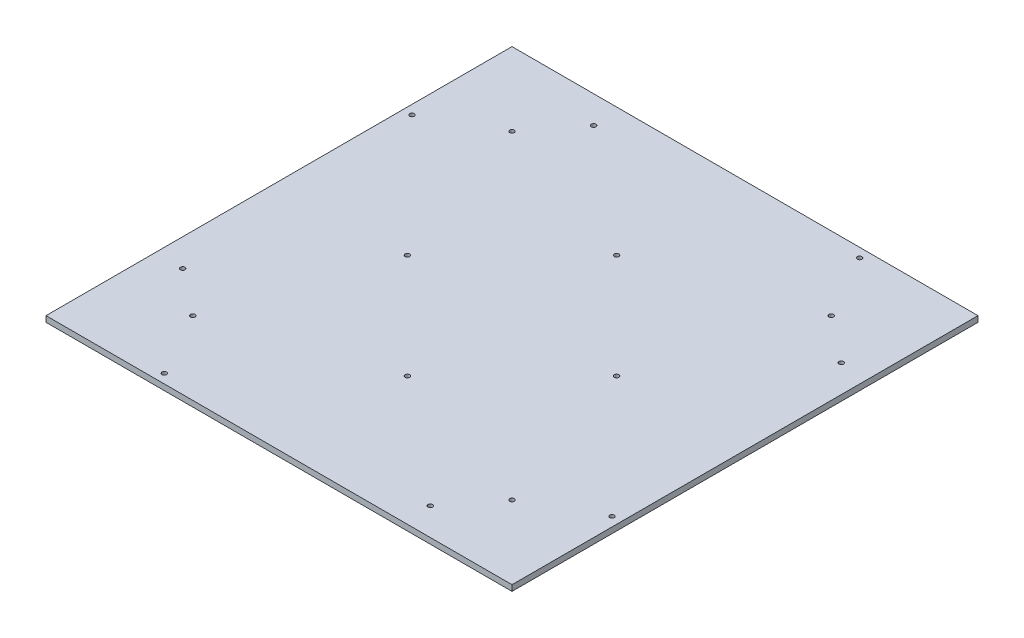
ISO-10303-21;
HEADER;
FILE_DESCRIPTION(('STEP AP214'),'2;1');
FILE_NAME('part.step','',(''),(''),'','','');
FILE_SCHEMA(('AUTOMOTIVE_DESIGN { 1 0 10303 214 1 1 1 1 }'));
ENDSEC;
DATA;
#1=APPLICATION_CONTEXT('core data for automotive mechanical design processes');
#2=APPLICATION_PROTOCOL_DEFINITION('international standard','automotive_design',2000,#1);
#3=PRODUCT_CONTEXT('',#1,'mechanical');
#4=PRODUCT('Part','Part','',(#3));
#5=PRODUCT_RELATED_PRODUCT_CATEGORY('part','',(#4));
#6=PRODUCT_DEFINITION_FORMATION('','',#4);
#7=PRODUCT_DEFINITION_CONTEXT('part definition',#1,'design');
#8=PRODUCT_DEFINITION('design','',#6,#7);
#9=PRODUCT_DEFINITION_SHAPE('','',#8);
#10=(LENGTH_UNIT() NAMED_UNIT(*) SI_UNIT(.MILLI.,.METRE.));
#11=(NAMED_UNIT(*) PLANE_ANGLE_UNIT() SI_UNIT($,.RADIAN.));
#12=(NAMED_UNIT(*) SI_UNIT($,.STERADIAN.) SOLID_ANGLE_UNIT());
#13=UNCERTAINTY_MEASURE_WITH_UNIT(LENGTH_MEASURE(1.E-05),#10,'distance_accuracy_value','');
#14=(GEOMETRIC_REPRESENTATION_CONTEXT(3) GLOBAL_UNCERTAINTY_ASSIGNED_CONTEXT((#13)) GLOBAL_UNIT_ASSIGNED_CONTEXT((#10,
#11,#12)) REPRESENTATION_CONTEXT('',''));
#15=CARTESIAN_POINT('',(0.,0.,0.));
#16=DIRECTION('',(0.,0.,1.));
#17=DIRECTION('',(1.,0.,0.));
#18=AXIS2_PLACEMENT_3D('',#15,#16,#17);
#19=CARTESIAN_POINT('',(127.,1.5875,127.));
#20=DIRECTION('',(-1.,0.,0.));
#21=DIRECTION('',(0.,0.,1.));
#22=AXIS2_PLACEMENT_3D('',#19,#20,#21);
#23=PLANE('',#22);
#24=DIRECTION('',(0.,0.,-1.));
#25=VECTOR('',#24,1.);
#26=CARTESIAN_POINT('',(127.,-1.5875,127.));
#27=LINE('',#26,#25);
#28=CARTESIAN_POINT('',(127.,-1.5875,127.));
#29=VERTEX_POINT('',#28);
#30=CARTESIAN_POINT('',(127.,-1.5875,-127.));
#31=VERTEX_POINT('',#30);
#32=EDGE_CURVE('E100',#29,#31,#27,.T.);
#33=ORIENTED_EDGE('',*,*,#32,.T.);
#34=DIRECTION('',(0.,-1.,0.));
#35=VECTOR('',#34,1.);
#36=CARTESIAN_POINT('',(127.,1.5875,-127.));
#37=LINE('',#36,#35);
#38=CARTESIAN_POINT('',(127.,1.5875,-127.));
#39=VERTEX_POINT('',#38);
#40=EDGE_CURVE('E11',#39,#31,#37,.T.);
#41=ORIENTED_EDGE('',*,*,#40,.F.);
#42=DIRECTION('',(0.,0.,-1.));
#43=VECTOR('',#42,1.);
#44=CARTESIAN_POINT('',(127.,1.5875,127.));
#45=LINE('',#44,#43);
#46=CARTESIAN_POINT('',(127.,1.5875,127.));
#47=VERTEX_POINT('',#46);
#48=EDGE_CURVE('E88',#47,#39,#45,.T.);
#49=ORIENTED_EDGE('',*,*,#48,.F.);
#50=DIRECTION('',(0.,-1.,0.));
#51=VECTOR('',#50,1.);
#52=CARTESIAN_POINT('',(127.,1.5875,127.));
#53=LINE('',#52,#51);
#54=EDGE_CURVE('E96',#47,#29,#53,.T.);
#55=ORIENTED_EDGE('',*,*,#54,.T.);
#56=EDGE_LOOP('',(#33,#41,#49,#55));
#57=FACE_BOUND('',#56,.T.);
#58=ADVANCED_FACE('F37',(#57),#23,.F.);
#59=CARTESIAN_POINT('',(-127.,1.5875,-127.));
#60=DIRECTION('',(0.,0.,1.));
#61=DIRECTION('',(1.,0.,0.));
#62=AXIS2_PLACEMENT_3D('',#59,#60,#61);
#63=PLANE('',#62);
#64=DIRECTION('',(-1.,0.,0.));
#65=VECTOR('',#64,1.);
#66=CARTESIAN_POINT('',(-127.,-1.5875,-127.));
#67=LINE('',#66,#65);
#68=CARTESIAN_POINT('',(-127.,-1.5875,-127.));
#69=VERTEX_POINT('',#68);
#70=EDGE_CURVE('E92',#31,#69,#67,.T.);
#71=ORIENTED_EDGE('',*,*,#70,.T.);
#72=DIRECTION('',(0.,-1.,0.));
#73=VECTOR('',#72,1.);
#74=CARTESIAN_POINT('',(-127.,1.5875,-127.));
#75=LINE('',#74,#73);
#76=CARTESIAN_POINT('',(-127.,1.5875,-127.));
#77=VERTEX_POINT('',#76);
#78=EDGE_CURVE('E45',#77,#69,#75,.T.);
#79=ORIENTED_EDGE('',*,*,#78,.F.);
#80=DIRECTION('',(-1.,0.,0.));
#81=VECTOR('',#80,1.);
#82=CARTESIAN_POINT('',(-127.,1.5875,-127.));
#83=LINE('',#82,#81);
#84=EDGE_CURVE('E83',#39,#77,#83,.T.);
#85=ORIENTED_EDGE('',*,*,#84,.F.);
#86=ORIENTED_EDGE('',*,*,#40,.T.);
#87=EDGE_LOOP('',(#71,#79,#85,#86));
#88=FACE_BOUND('',#87,.T.);
#89=ADVANCED_FACE('F91',(#88),#63,.F.);
#90=CARTESIAN_POINT('',(-127.,1.5875,127.));
#91=DIRECTION('',(1.,0.,0.));
#92=DIRECTION('',(0.,0.,-1.));
#93=AXIS2_PLACEMENT_3D('',#90,#91,#92);
#94=PLANE('',#93);
#95=DIRECTION('',(0.,0.,1.));
#96=VECTOR('',#95,1.);
#97=CARTESIAN_POINT('',(-127.,-1.5875,127.));
#98=LINE('',#97,#96);
#99=CARTESIAN_POINT('',(-127.,-1.5875,127.));
#100=VERTEX_POINT('',#99);
#101=EDGE_CURVE('E70',#69,#100,#98,.T.);
#102=ORIENTED_EDGE('',*,*,#101,.T.);
#103=DIRECTION('',(0.,-1.,0.));
#104=VECTOR('',#103,1.);
#105=CARTESIAN_POINT('',(-127.,1.5875,127.));
#106=LINE('',#105,#104);
#107=CARTESIAN_POINT('',(-127.,1.5875,127.));
#108=VERTEX_POINT('',#107);
#109=EDGE_CURVE('E93',#108,#100,#106,.T.);
#110=ORIENTED_EDGE('',*,*,#109,.F.);
#111=DIRECTION('',(0.,0.,1.));
#112=VECTOR('',#111,1.);
#113=CARTESIAN_POINT('',(-127.,1.5875,127.));
#114=LINE('',#113,#112);
#115=EDGE_CURVE('E86',#77,#108,#114,.T.);
#116=ORIENTED_EDGE('',*,*,#115,.F.);
#117=ORIENTED_EDGE('',*,*,#78,.T.);
#118=EDGE_LOOP('',(#102,#110,#116,#117));
#119=FACE_BOUND('',#118,.T.);
#120=ADVANCED_FACE('F94',(#119),#94,.F.);
#121=CARTESIAN_POINT('',(-127.,1.5875,127.));
#122=DIRECTION('',(0.,0.,-1.));
#123=DIRECTION('',(-1.,0.,0.));
#124=AXIS2_PLACEMENT_3D('',#121,#122,#123);
#125=PLANE('',#124);
#126=DIRECTION('',(1.,0.,0.));
#127=VECTOR('',#126,1.);
#128=CARTESIAN_POINT('',(-127.,-1.5875,127.));
#129=LINE('',#128,#127);
#130=EDGE_CURVE('E76',#100,#29,#129,.T.);
#131=ORIENTED_EDGE('',*,*,#130,.T.);
#132=ORIENTED_EDGE('',*,*,#54,.F.);
#133=DIRECTION('',(1.,0.,0.));
#134=VECTOR('',#133,1.);
#135=CARTESIAN_POINT('',(-127.,1.5875,127.));
#136=LINE('',#135,#134);
#137=EDGE_CURVE('E53',#108,#47,#136,.T.);
#138=ORIENTED_EDGE('',*,*,#137,.F.);
#139=ORIENTED_EDGE('',*,*,#109,.T.);
#140=EDGE_LOOP('',(#131,#132,#138,#139));
#141=FACE_BOUND('',#140,.T.);
#142=ADVANCED_FACE('F108',(#141),#125,.F.);
#143=CARTESIAN_POINT('',(0.,1.5875,0.));
#144=DIRECTION('',(0.,-1.,0.));
#145=DIRECTION('',(0.,0.,-1.));
#146=AXIS2_PLACEMENT_3D('',#143,#144,#145);
#147=PLANE('',#146);
#148=CARTESIAN_POINT('',(0.,1.5875,-57.));
#149=DIRECTION('',(0.,1.,0.));
#150=DIRECTION('',(0.,0.,1.));
#151=AXIS2_PLACEMENT_3D('',#148,#149,#150);
#152=CIRCLE('',#151,1.24999999999999);
#153=CARTESIAN_POINT('',(0.,1.5875,-55.75));
#154=VERTEX_POINT('',#153);
#155=EDGE_CURVE('E206',#154,#154,#152,.T.);
#156=ORIENTED_EDGE('',*,*,#155,.F.);
#157=EDGE_LOOP('',(#156));
#158=FACE_BOUND('',#157,.T.);
#159=CARTESIAN_POINT('',(-57.,1.5875,0.));
#160=DIRECTION('',(0.,1.,0.));
#161=DIRECTION('',(0.,0.,1.));
#162=AXIS2_PLACEMENT_3D('',#159,#160,#161);
#163=CIRCLE('',#162,1.24999999999999);
#164=CARTESIAN_POINT('',(-57.,1.5875,1.24999999999999));
#165=VERTEX_POINT('',#164);
#166=EDGE_CURVE('E200',#165,#165,#163,.T.);
#167=ORIENTED_EDGE('',*,*,#166,.F.);
#168=EDGE_LOOP('',(#167));
#169=FACE_BOUND('',#168,.T.);
#170=CARTESIAN_POINT('',(0.,1.5875,57.));
#171=DIRECTION('',(0.,1.,0.));
#172=DIRECTION('',(0.,0.,1.));
#173=AXIS2_PLACEMENT_3D('',#170,#171,#172);
#174=CIRCLE('',#173,1.24999999999999);
#175=CARTESIAN_POINT('',(0.,1.5875,58.25));
#176=VERTEX_POINT('',#175);
#177=EDGE_CURVE('E194',#176,#176,#174,.T.);
#178=ORIENTED_EDGE('',*,*,#177,.F.);
#179=EDGE_LOOP('',(#178));
#180=FACE_BOUND('',#179,.T.);
#181=CARTESIAN_POINT('',(57.,1.5875,0.));
#182=DIRECTION('',(0.,1.,0.));
#183=DIRECTION('',(0.,0.,1.));
#184=AXIS2_PLACEMENT_3D('',#181,#182,#183);
#185=CIRCLE('',#184,1.24999999999999);
#186=CARTESIAN_POINT('',(57.,1.5875,1.24999999999999));
#187=VERTEX_POINT('',#186);
#188=EDGE_CURVE('E188',#187,#187,#185,.T.);
#189=ORIENTED_EDGE('',*,*,#188,.F.);
#190=EDGE_LOOP('',(#189));
#191=FACE_BOUND('',#190,.T.);
#192=CARTESIAN_POINT('',(87.,1.5875,-87.));
#193=DIRECTION('',(0.,1.,0.));
#194=DIRECTION('',(0.,0.,1.));
#195=AXIS2_PLACEMENT_3D('',#192,#193,#194);
#196=CIRCLE('',#195,1.24999999999999);
#197=CARTESIAN_POINT('',(87.,1.5875,-85.75));
#198=VERTEX_POINT('',#197);
#199=EDGE_CURVE('E182',#198,#198,#196,.T.);
#200=ORIENTED_EDGE('',*,*,#199,.F.);
#201=EDGE_LOOP('',(#200));
#202=FACE_BOUND('',#201,.T.);
#203=CARTESIAN_POINT('',(-87.,1.5875,-87.));
#204=DIRECTION('',(0.,1.,0.));
#205=DIRECTION('',(0.,0.,1.));
#206=AXIS2_PLACEMENT_3D('',#203,#204,#205);
#207=CIRCLE('',#206,1.24999999999999);
#208=CARTESIAN_POINT('',(-87.,1.5875,-85.75));
#209=VERTEX_POINT('',#208);
#210=EDGE_CURVE('E176',#209,#209,#207,.T.);
#211=ORIENTED_EDGE('',*,*,#210,.F.);
#212=EDGE_LOOP('',(#211));
#213=FACE_BOUND('',#212,.T.);
#214=CARTESIAN_POINT('',(-87.,1.5875,87.));
#215=DIRECTION('',(0.,1.,0.));
#216=DIRECTION('',(0.,0.,1.));
#217=AXIS2_PLACEMENT_3D('',#214,#215,#216);
#218=CIRCLE('',#217,1.24999999999999);
#219=CARTESIAN_POINT('',(-87.,1.5875,88.25));
#220=VERTEX_POINT('',#219);
#221=EDGE_CURVE('E170',#220,#220,#218,.T.);
#222=ORIENTED_EDGE('',*,*,#221,.F.);
#223=EDGE_LOOP('',(#222));
#224=FACE_BOUND('',#223,.T.);
#225=CARTESIAN_POINT('',(87.,1.5875,87.));
#226=DIRECTION('',(0.,1.,0.));
#227=DIRECTION('',(0.,0.,1.));
#228=AXIS2_PLACEMENT_3D('',#225,#226,#227);
#229=CIRCLE('',#228,1.24999999999999);
#230=CARTESIAN_POINT('',(87.,1.5875,88.25));
#231=VERTEX_POINT('',#230);
#232=EDGE_CURVE('E164',#231,#231,#229,.T.);
#233=ORIENTED_EDGE('',*,*,#232,.F.);
#234=EDGE_LOOP('',(#233));
#235=FACE_BOUND('',#234,.T.);
#236=CARTESIAN_POINT('',(112.,1.5875,-67.5));
#237=DIRECTION('',(0.,1.,0.));
#238=DIRECTION('',(0.,0.,1.));
#239=AXIS2_PLACEMENT_3D('',#236,#237,#238);
#240=CIRCLE('',#239,1.24999999999999);
#241=CARTESIAN_POINT('',(112.,1.5875,-66.25));
#242=VERTEX_POINT('',#241);
#243=EDGE_CURVE('E158',#242,#242,#240,.T.);
#244=ORIENTED_EDGE('',*,*,#243,.F.);
#245=EDGE_LOOP('',(#244));
#246=FACE_BOUND('',#245,.T.);
#247=CARTESIAN_POINT('',(67.5000000000001,1.5875,-122.));
#248=DIRECTION('',(0.,1.,0.));
#249=DIRECTION('',(0.,0.,1.));
#250=AXIS2_PLACEMENT_3D('',#247,#248,#249);
#251=CIRCLE('',#250,1.24999999999999);
#252=CARTESIAN_POINT('',(67.5000000000001,1.5875,-120.75));
#253=VERTEX_POINT('',#252);
#254=EDGE_CURVE('E152',#253,#253,#251,.T.);
#255=ORIENTED_EDGE('',*,*,#254,.F.);
#256=EDGE_LOOP('',(#255));
#257=FACE_BOUND('',#256,.T.);
#258=CARTESIAN_POINT('',(-67.4999999999999,1.5875,-112.));
#259=DIRECTION('',(0.,1.,0.));
#260=DIRECTION('',(0.,0.,1.));
#261=AXIS2_PLACEMENT_3D('',#258,#259,#260);
#262=CIRCLE('',#261,1.24999999999999);
#263=CARTESIAN_POINT('',(-67.4999999999999,1.5875,-110.75));
#264=VERTEX_POINT('',#263);
#265=EDGE_CURVE('E146',#264,#264,#262,.T.);
#266=ORIENTED_EDGE('',*,*,#265,.F.);
#267=EDGE_LOOP('',(#266));
#268=FACE_BOUND('',#267,.T.);
#269=CARTESIAN_POINT('',(-122.,1.5875,-67.5));
#270=DIRECTION('',(0.,1.,0.));
#271=DIRECTION('',(0.,0.,1.));
#272=AXIS2_PLACEMENT_3D('',#269,#270,#271);
#273=CIRCLE('',#272,1.24999999999999);
#274=CARTESIAN_POINT('',(-122.,1.5875,-66.2500000000001));
#275=VERTEX_POINT('',#274);
#276=EDGE_CURVE('E140',#275,#275,#273,.T.);
#277=ORIENTED_EDGE('',*,*,#276,.F.);
#278=EDGE_LOOP('',(#277));
#279=FACE_BOUND('',#278,.T.);
#280=CARTESIAN_POINT('',(-112.,1.5875,67.5));
#281=DIRECTION('',(0.,1.,0.));
#282=DIRECTION('',(0.,0.,1.));
#283=AXIS2_PLACEMENT_3D('',#280,#281,#282);
#284=CIRCLE('',#283,1.24999999999999);
#285=CARTESIAN_POINT('',(-112.,1.5875,68.75));
#286=VERTEX_POINT('',#285);
#287=EDGE_CURVE('E134',#286,#286,#284,.T.);
#288=ORIENTED_EDGE('',*,*,#287,.F.);
#289=EDGE_LOOP('',(#288));
#290=FACE_BOUND('',#289,.T.);
#291=CARTESIAN_POINT('',(-67.5,1.5875,122.));
#292=DIRECTION('',(0.,1.,0.));
#293=DIRECTION('',(0.,0.,1.));
#294=AXIS2_PLACEMENT_3D('',#291,#292,#293);
#295=CIRCLE('',#294,1.24999999999999);
#296=CARTESIAN_POINT('',(-67.5,1.5875,123.25));
#297=VERTEX_POINT('',#296);
#298=EDGE_CURVE('E128',#297,#297,#295,.T.);
#299=ORIENTED_EDGE('',*,*,#298,.F.);
#300=EDGE_LOOP('',(#299));
#301=FACE_BOUND('',#300,.T.);
#302=CARTESIAN_POINT('',(67.5,1.5875,112.));
#303=DIRECTION('',(0.,1.,0.));
#304=DIRECTION('',(0.,0.,1.));
#305=AXIS2_PLACEMENT_3D('',#302,#303,#304);
#306=CIRCLE('',#305,1.24999999999999);
#307=CARTESIAN_POINT('',(67.5,1.5875,113.25));
#308=VERTEX_POINT('',#307);
#309=EDGE_CURVE('E122',#308,#308,#306,.T.);
#310=ORIENTED_EDGE('',*,*,#309,.F.);
#311=EDGE_LOOP('',(#310));
#312=FACE_BOUND('',#311,.T.);
#313=CARTESIAN_POINT('',(122.,1.5875,67.5));
#314=DIRECTION('',(0.,1.,0.));
#315=DIRECTION('',(0.,0.,1.));
#316=AXIS2_PLACEMENT_3D('',#313,#314,#315);
#317=CIRCLE('',#316,1.24999999999999);
#318=CARTESIAN_POINT('',(122.,1.5875,68.75));
#319=VERTEX_POINT('',#318);
#320=EDGE_CURVE('E116',#319,#319,#317,.T.);
#321=ORIENTED_EDGE('',*,*,#320,.F.);
#322=EDGE_LOOP('',(#321));
#323=FACE_BOUND('',#322,.T.);
#324=ORIENTED_EDGE('',*,*,#48,.T.);
#325=ORIENTED_EDGE('',*,*,#84,.T.);
#326=ORIENTED_EDGE('',*,*,#115,.T.);
#327=ORIENTED_EDGE('',*,*,#137,.T.);
#328=EDGE_LOOP('',(#324,#325,#326,#327));
#329=FACE_BOUND('',#328,.T.);
#330=ADVANCED_FACE('F84',(#158,#169,#180,#191,#202,#213,#224,#235,#246,#257,#268,#279,#290,#301,
#312,#323,#329),#147,.F.);
#331=CARTESIAN_POINT('',(0.,-1.5875,0.));
#332=DIRECTION('',(0.,-1.,0.));
#333=DIRECTION('',(0.,0.,-1.));
#334=AXIS2_PLACEMENT_3D('',#331,#332,#333);
#335=PLANE('',#334);
#336=CARTESIAN_POINT('',(0.,-1.5875,-57.));
#337=DIRECTION('',(0.,1.,0.));
#338=DIRECTION('',(0.,0.,1.));
#339=AXIS2_PLACEMENT_3D('',#336,#337,#338);
#340=CIRCLE('',#339,1.25);
#341=CARTESIAN_POINT('',(0.,-1.5875,-55.75));
#342=VERTEX_POINT('',#341);
#343=EDGE_CURVE('E203',#342,#342,#340,.T.);
#344=ORIENTED_EDGE('',*,*,#343,.T.);
#345=EDGE_LOOP('',(#344));
#346=FACE_BOUND('',#345,.T.);
#347=CARTESIAN_POINT('',(-57.,-1.5875,0.));
#348=DIRECTION('',(0.,1.,0.));
#349=DIRECTION('',(0.,0.,1.));
#350=AXIS2_PLACEMENT_3D('',#347,#348,#349);
#351=CIRCLE('',#350,1.25);
#352=CARTESIAN_POINT('',(-57.,-1.5875,1.25));
#353=VERTEX_POINT('',#352);
#354=EDGE_CURVE('E197',#353,#353,#351,.T.);
#355=ORIENTED_EDGE('',*,*,#354,.T.);
#356=EDGE_LOOP('',(#355));
#357=FACE_BOUND('',#356,.T.);
#358=CARTESIAN_POINT('',(0.,-1.5875,57.));
#359=DIRECTION('',(0.,1.,0.));
#360=DIRECTION('',(0.,0.,1.));
#361=AXIS2_PLACEMENT_3D('',#358,#359,#360);
#362=CIRCLE('',#361,1.25);
#363=CARTESIAN_POINT('',(0.,-1.5875,58.25));
#364=VERTEX_POINT('',#363);
#365=EDGE_CURVE('E191',#364,#364,#362,.T.);
#366=ORIENTED_EDGE('',*,*,#365,.T.);
#367=EDGE_LOOP('',(#366));
#368=FACE_BOUND('',#367,.T.);
#369=CARTESIAN_POINT('',(57.,-1.5875,0.));
#370=DIRECTION('',(0.,1.,0.));
#371=DIRECTION('',(0.,0.,1.));
#372=AXIS2_PLACEMENT_3D('',#369,#370,#371);
#373=CIRCLE('',#372,1.25);
#374=CARTESIAN_POINT('',(57.,-1.5875,1.25));
#375=VERTEX_POINT('',#374);
#376=EDGE_CURVE('E185',#375,#375,#373,.T.);
#377=ORIENTED_EDGE('',*,*,#376,.T.);
#378=EDGE_LOOP('',(#377));
#379=FACE_BOUND('',#378,.T.);
#380=CARTESIAN_POINT('',(87.,-1.5875,-87.));
#381=DIRECTION('',(0.,1.,0.));
#382=DIRECTION('',(0.,0.,1.));
#383=AXIS2_PLACEMENT_3D('',#380,#381,#382);
#384=CIRCLE('',#383,1.25);
#385=CARTESIAN_POINT('',(87.,-1.5875,-85.75));
#386=VERTEX_POINT('',#385);
#387=EDGE_CURVE('E179',#386,#386,#384,.T.);
#388=ORIENTED_EDGE('',*,*,#387,.T.);
#389=EDGE_LOOP('',(#388));
#390=FACE_BOUND('',#389,.T.);
#391=CARTESIAN_POINT('',(-87.,-1.5875,-87.));
#392=DIRECTION('',(0.,1.,0.));
#393=DIRECTION('',(0.,0.,1.));
#394=AXIS2_PLACEMENT_3D('',#391,#392,#393);
#395=CIRCLE('',#394,1.25);
#396=CARTESIAN_POINT('',(-87.,-1.5875,-85.75));
#397=VERTEX_POINT('',#396);
#398=EDGE_CURVE('E173',#397,#397,#395,.T.);
#399=ORIENTED_EDGE('',*,*,#398,.T.);
#400=EDGE_LOOP('',(#399));
#401=FACE_BOUND('',#400,.T.);
#402=CARTESIAN_POINT('',(-87.,-1.5875,87.));
#403=DIRECTION('',(0.,1.,0.));
#404=DIRECTION('',(0.,0.,1.));
#405=AXIS2_PLACEMENT_3D('',#402,#403,#404);
#406=CIRCLE('',#405,1.25);
#407=CARTESIAN_POINT('',(-87.,-1.5875,88.25));
#408=VERTEX_POINT('',#407);
#409=EDGE_CURVE('E167',#408,#408,#406,.T.);
#410=ORIENTED_EDGE('',*,*,#409,.T.);
#411=EDGE_LOOP('',(#410));
#412=FACE_BOUND('',#411,.T.);
#413=CARTESIAN_POINT('',(87.,-1.5875,87.));
#414=DIRECTION('',(0.,1.,0.));
#415=DIRECTION('',(0.,0.,1.));
#416=AXIS2_PLACEMENT_3D('',#413,#414,#415);
#417=CIRCLE('',#416,1.25);
#418=CARTESIAN_POINT('',(87.,-1.5875,88.25));
#419=VERTEX_POINT('',#418);
#420=EDGE_CURVE('E161',#419,#419,#417,.T.);
#421=ORIENTED_EDGE('',*,*,#420,.T.);
#422=EDGE_LOOP('',(#421));
#423=FACE_BOUND('',#422,.T.);
#424=CARTESIAN_POINT('',(112.,-1.5875,-67.5));
#425=DIRECTION('',(0.,1.,0.));
#426=DIRECTION('',(0.,0.,1.));
#427=AXIS2_PLACEMENT_3D('',#424,#425,#426);
#428=CIRCLE('',#427,1.25);
#429=CARTESIAN_POINT('',(112.,-1.5875,-66.25));
#430=VERTEX_POINT('',#429);
#431=EDGE_CURVE('E155',#430,#430,#428,.T.);
#432=ORIENTED_EDGE('',*,*,#431,.T.);
#433=EDGE_LOOP('',(#432));
#434=FACE_BOUND('',#433,.T.);
#435=CARTESIAN_POINT('',(67.5000000000001,-1.5875,-122.));
#436=DIRECTION('',(0.,1.,0.));
#437=DIRECTION('',(0.,0.,1.));
#438=AXIS2_PLACEMENT_3D('',#435,#436,#437);
#439=CIRCLE('',#438,1.25);
#440=CARTESIAN_POINT('',(67.5000000000001,-1.5875,-120.75));
#441=VERTEX_POINT('',#440);
#442=EDGE_CURVE('E149',#441,#441,#439,.T.);
#443=ORIENTED_EDGE('',*,*,#442,.T.);
#444=EDGE_LOOP('',(#443));
#445=FACE_BOUND('',#444,.T.);
#446=CARTESIAN_POINT('',(-67.4999999999999,-1.5875,-112.));
#447=DIRECTION('',(0.,1.,0.));
#448=DIRECTION('',(0.,0.,1.));
#449=AXIS2_PLACEMENT_3D('',#446,#447,#448);
#450=CIRCLE('',#449,1.25);
#451=CARTESIAN_POINT('',(-67.4999999999999,-1.5875,-110.75));
#452=VERTEX_POINT('',#451);
#453=EDGE_CURVE('E143',#452,#452,#450,.T.);
#454=ORIENTED_EDGE('',*,*,#453,.T.);
#455=EDGE_LOOP('',(#454));
#456=FACE_BOUND('',#455,.T.);
#457=CARTESIAN_POINT('',(-122.,-1.5875,-67.5));
#458=DIRECTION('',(0.,1.,0.));
#459=DIRECTION('',(0.,0.,1.));
#460=AXIS2_PLACEMENT_3D('',#457,#458,#459);
#461=CIRCLE('',#460,1.25);
#462=CARTESIAN_POINT('',(-122.,-1.5875,-66.25));
#463=VERTEX_POINT('',#462);
#464=EDGE_CURVE('E137',#463,#463,#461,.T.);
#465=ORIENTED_EDGE('',*,*,#464,.T.);
#466=EDGE_LOOP('',(#465));
#467=FACE_BOUND('',#466,.T.);
#468=CARTESIAN_POINT('',(-112.,-1.5875,67.5));
#469=DIRECTION('',(0.,1.,0.));
#470=DIRECTION('',(0.,0.,1.));
#471=AXIS2_PLACEMENT_3D('',#468,#469,#470);
#472=CIRCLE('',#471,1.25);
#473=CARTESIAN_POINT('',(-112.,-1.5875,68.75));
#474=VERTEX_POINT('',#473);
#475=EDGE_CURVE('E131',#474,#474,#472,.T.);
#476=ORIENTED_EDGE('',*,*,#475,.T.);
#477=EDGE_LOOP('',(#476));
#478=FACE_BOUND('',#477,.T.);
#479=CARTESIAN_POINT('',(-67.5,-1.5875,122.));
#480=DIRECTION('',(0.,1.,0.));
#481=DIRECTION('',(0.,0.,1.));
#482=AXIS2_PLACEMENT_3D('',#479,#480,#481);
#483=CIRCLE('',#482,1.25);
#484=CARTESIAN_POINT('',(-67.5,-1.5875,123.25));
#485=VERTEX_POINT('',#484);
#486=EDGE_CURVE('E125',#485,#485,#483,.T.);
#487=ORIENTED_EDGE('',*,*,#486,.T.);
#488=EDGE_LOOP('',(#487));
#489=FACE_BOUND('',#488,.T.);
#490=CARTESIAN_POINT('',(67.5,-1.5875,112.));
#491=DIRECTION('',(0.,1.,0.));
#492=DIRECTION('',(0.,0.,1.));
#493=AXIS2_PLACEMENT_3D('',#490,#491,#492);
#494=CIRCLE('',#493,1.25);
#495=CARTESIAN_POINT('',(67.5,-1.5875,113.25));
#496=VERTEX_POINT('',#495);
#497=EDGE_CURVE('E119',#496,#496,#494,.T.);
#498=ORIENTED_EDGE('',*,*,#497,.T.);
#499=EDGE_LOOP('',(#498));
#500=FACE_BOUND('',#499,.T.);
#501=CARTESIAN_POINT('',(122.,-1.5875,67.5));
#502=DIRECTION('',(0.,1.,0.));
#503=DIRECTION('',(0.,0.,1.));
#504=AXIS2_PLACEMENT_3D('',#501,#502,#503);
#505=CIRCLE('',#504,1.25);
#506=CARTESIAN_POINT('',(122.,-1.5875,68.75));
#507=VERTEX_POINT('',#506);
#508=EDGE_CURVE('E103',#507,#507,#505,.T.);
#509=ORIENTED_EDGE('',*,*,#508,.T.);
#510=EDGE_LOOP('',(#509));
#511=FACE_BOUND('',#510,.T.);
#512=ORIENTED_EDGE('',*,*,#32,.F.);
#513=ORIENTED_EDGE('',*,*,#130,.F.);
#514=ORIENTED_EDGE('',*,*,#101,.F.);
#515=ORIENTED_EDGE('',*,*,#70,.F.);
#516=EDGE_LOOP('',(#512,#513,#514,#515));
#517=FACE_BOUND('',#516,.T.);
#518=ADVANCED_FACE('F111',(#346,#357,#368,#379,#390,#401,#412,#423,#434,#445,#456,#467,#478,
#489,#500,#511,#517),#335,.T.);
#519=CARTESIAN_POINT('',(122.,1.5875,67.5));
#520=DIRECTION('',(0.,1.,0.));
#521=DIRECTION('',(0.,0.,1.));
#522=AXIS2_PLACEMENT_3D('',#519,#520,#521);
#523=CYLINDRICAL_SURFACE('',#522,1.24999999999999);
#524=ORIENTED_EDGE('',*,*,#508,.F.);
#525=EDGE_LOOP('',(#524));
#526=FACE_BOUND('',#525,.T.);
#527=ORIENTED_EDGE('',*,*,#320,.T.);
#528=EDGE_LOOP('',(#527));
#529=FACE_BOUND('',#528,.T.);
#530=ADVANCED_FACE('F245',(#526,#529),#523,.F.);
#531=CARTESIAN_POINT('',(67.5,1.5875,112.));
#532=DIRECTION('',(0.,1.,0.));
#533=DIRECTION('',(0.,0.,1.));
#534=AXIS2_PLACEMENT_3D('',#531,#532,#533);
#535=CYLINDRICAL_SURFACE('',#534,1.24999999999999);
#536=ORIENTED_EDGE('',*,*,#497,.F.);
#537=EDGE_LOOP('',(#536));
#538=FACE_BOUND('',#537,.T.);
#539=ORIENTED_EDGE('',*,*,#309,.T.);
#540=EDGE_LOOP('',(#539));
#541=FACE_BOUND('',#540,.T.);
#542=ADVANCED_FACE('F247',(#538,#541),#535,.F.);
#543=CARTESIAN_POINT('',(-67.5,1.5875,122.));
#544=DIRECTION('',(0.,1.,0.));
#545=DIRECTION('',(0.,0.,1.));
#546=AXIS2_PLACEMENT_3D('',#543,#544,#545);
#547=CYLINDRICAL_SURFACE('',#546,1.24999999999999);
#548=ORIENTED_EDGE('',*,*,#486,.F.);
#549=EDGE_LOOP('',(#548));
#550=FACE_BOUND('',#549,.T.);
#551=ORIENTED_EDGE('',*,*,#298,.T.);
#552=EDGE_LOOP('',(#551));
#553=FACE_BOUND('',#552,.T.);
#554=ADVANCED_FACE('F254',(#550,#553),#547,.F.);
#555=CARTESIAN_POINT('',(-112.,1.5875,67.5));
#556=DIRECTION('',(0.,1.,0.));
#557=DIRECTION('',(0.,0.,1.));
#558=AXIS2_PLACEMENT_3D('',#555,#556,#557);
#559=CYLINDRICAL_SURFACE('',#558,1.24999999999999);
#560=ORIENTED_EDGE('',*,*,#475,.F.);
#561=EDGE_LOOP('',(#560));
#562=FACE_BOUND('',#561,.T.);
#563=ORIENTED_EDGE('',*,*,#287,.T.);
#564=EDGE_LOOP('',(#563));
#565=FACE_BOUND('',#564,.T.);
#566=ADVANCED_FACE('F443',(#562,#565),#559,.F.);
#567=CARTESIAN_POINT('',(-122.,1.5875,-67.5));
#568=DIRECTION('',(0.,1.,0.));
#569=DIRECTION('',(0.,0.,1.));
#570=AXIS2_PLACEMENT_3D('',#567,#568,#569);
#571=CYLINDRICAL_SURFACE('',#570,1.24999999999999);
#572=ORIENTED_EDGE('',*,*,#464,.F.);
#573=EDGE_LOOP('',(#572));
#574=FACE_BOUND('',#573,.T.);
#575=ORIENTED_EDGE('',*,*,#276,.T.);
#576=EDGE_LOOP('',(#575));
#577=FACE_BOUND('',#576,.T.);
#578=ADVANCED_FACE('F435',(#574,#577),#571,.F.);
#579=CARTESIAN_POINT('',(-67.4999999999999,1.5875,-112.));
#580=DIRECTION('',(0.,1.,0.));
#581=DIRECTION('',(0.,0.,1.));
#582=AXIS2_PLACEMENT_3D('',#579,#580,#581);
#583=CYLINDRICAL_SURFACE('',#582,1.24999999999999);
#584=ORIENTED_EDGE('',*,*,#453,.F.);
#585=EDGE_LOOP('',(#584));
#586=FACE_BOUND('',#585,.T.);
#587=ORIENTED_EDGE('',*,*,#265,.T.);
#588=EDGE_LOOP('',(#587));
#589=FACE_BOUND('',#588,.T.);
#590=ADVANCED_FACE('F427',(#586,#589),#583,.F.);
#591=CARTESIAN_POINT('',(67.5000000000001,1.5875,-122.));
#592=DIRECTION('',(0.,1.,0.));
#593=DIRECTION('',(0.,0.,1.));
#594=AXIS2_PLACEMENT_3D('',#591,#592,#593);
#595=CYLINDRICAL_SURFACE('',#594,1.24999999999999);
#596=ORIENTED_EDGE('',*,*,#442,.F.);
#597=EDGE_LOOP('',(#596));
#598=FACE_BOUND('',#597,.T.);
#599=ORIENTED_EDGE('',*,*,#254,.T.);
#600=EDGE_LOOP('',(#599));
#601=FACE_BOUND('',#600,.T.);
#602=ADVANCED_FACE('F419',(#598,#601),#595,.F.);
#603=CARTESIAN_POINT('',(112.,1.5875,-67.5));
#604=DIRECTION('',(0.,1.,0.));
#605=DIRECTION('',(0.,0.,1.));
#606=AXIS2_PLACEMENT_3D('',#603,#604,#605);
#607=CYLINDRICAL_SURFACE('',#606,1.24999999999999);
#608=ORIENTED_EDGE('',*,*,#431,.F.);
#609=EDGE_LOOP('',(#608));
#610=FACE_BOUND('',#609,.T.);
#611=ORIENTED_EDGE('',*,*,#243,.T.);
#612=EDGE_LOOP('',(#611));
#613=FACE_BOUND('',#612,.T.);
#614=ADVANCED_FACE('F303',(#610,#613),#607,.F.);
#615=CARTESIAN_POINT('',(87.,1.5875,87.));
#616=DIRECTION('',(0.,1.,0.));
#617=DIRECTION('',(0.,0.,1.));
#618=AXIS2_PLACEMENT_3D('',#615,#616,#617);
#619=CYLINDRICAL_SURFACE('',#618,1.24999999999999);
#620=ORIENTED_EDGE('',*,*,#420,.F.);
#621=EDGE_LOOP('',(#620));
#622=FACE_BOUND('',#621,.T.);
#623=ORIENTED_EDGE('',*,*,#232,.T.);
#624=EDGE_LOOP('',(#623));
#625=FACE_BOUND('',#624,.T.);
#626=ADVANCED_FACE('F296',(#622,#625),#619,.F.);
#627=CARTESIAN_POINT('',(-87.,1.5875,87.));
#628=DIRECTION('',(0.,1.,0.));
#629=DIRECTION('',(0.,0.,1.));
#630=AXIS2_PLACEMENT_3D('',#627,#628,#629);
#631=CYLINDRICAL_SURFACE('',#630,1.24999999999999);
#632=ORIENTED_EDGE('',*,*,#409,.F.);
#633=EDGE_LOOP('',(#632));
#634=FACE_BOUND('',#633,.T.);
#635=ORIENTED_EDGE('',*,*,#221,.T.);
#636=EDGE_LOOP('',(#635));
#637=FACE_BOUND('',#636,.T.);
#638=ADVANCED_FACE('F302',(#634,#637),#631,.F.);
#639=CARTESIAN_POINT('',(-87.,1.5875,-87.));
#640=DIRECTION('',(0.,1.,0.));
#641=DIRECTION('',(0.,0.,1.));
#642=AXIS2_PLACEMENT_3D('',#639,#640,#641);
#643=CYLINDRICAL_SURFACE('',#642,1.24999999999999);
#644=ORIENTED_EDGE('',*,*,#398,.F.);
#645=EDGE_LOOP('',(#644));
#646=FACE_BOUND('',#645,.T.);
#647=ORIENTED_EDGE('',*,*,#210,.T.);
#648=EDGE_LOOP('',(#647));
#649=FACE_BOUND('',#648,.T.);
#650=ADVANCED_FACE('F317',(#646,#649),#643,.F.);
#651=CARTESIAN_POINT('',(87.,1.5875,-87.));
#652=DIRECTION('',(0.,1.,0.));
#653=DIRECTION('',(0.,0.,1.));
#654=AXIS2_PLACEMENT_3D('',#651,#652,#653);
#655=CYLINDRICAL_SURFACE('',#654,1.24999999999999);
#656=ORIENTED_EDGE('',*,*,#387,.F.);
#657=EDGE_LOOP('',(#656));
#658=FACE_BOUND('',#657,.T.);
#659=ORIENTED_EDGE('',*,*,#199,.T.);
#660=EDGE_LOOP('',(#659));
#661=FACE_BOUND('',#660,.T.);
#662=ADVANCED_FACE('F329',(#658,#661),#655,.F.);
#663=CARTESIAN_POINT('',(57.,1.5875,0.));
#664=DIRECTION('',(0.,1.,0.));
#665=DIRECTION('',(0.,0.,1.));
#666=AXIS2_PLACEMENT_3D('',#663,#664,#665);
#667=CYLINDRICAL_SURFACE('',#666,1.24999999999999);
#668=ORIENTED_EDGE('',*,*,#376,.F.);
#669=EDGE_LOOP('',(#668));
#670=FACE_BOUND('',#669,.T.);
#671=ORIENTED_EDGE('',*,*,#188,.T.);
#672=EDGE_LOOP('',(#671));
#673=FACE_BOUND('',#672,.T.);
#674=ADVANCED_FACE('F341',(#670,#673),#667,.F.);
#675=CARTESIAN_POINT('',(0.,1.5875,57.));
#676=DIRECTION('',(0.,1.,0.));
#677=DIRECTION('',(0.,0.,1.));
#678=AXIS2_PLACEMENT_3D('',#675,#676,#677);
#679=CYLINDRICAL_SURFACE('',#678,1.24999999999999);
#680=ORIENTED_EDGE('',*,*,#365,.F.);
#681=EDGE_LOOP('',(#680));
#682=FACE_BOUND('',#681,.T.);
#683=ORIENTED_EDGE('',*,*,#177,.T.);
#684=EDGE_LOOP('',(#683));
#685=FACE_BOUND('',#684,.T.);
#686=ADVANCED_FACE('F353',(#682,#685),#679,.F.);
#687=CARTESIAN_POINT('',(-57.,1.5875,0.));
#688=DIRECTION('',(0.,1.,0.));
#689=DIRECTION('',(0.,0.,1.));
#690=AXIS2_PLACEMENT_3D('',#687,#688,#689);
#691=CYLINDRICAL_SURFACE('',#690,1.24999999999999);
#692=ORIENTED_EDGE('',*,*,#354,.F.);
#693=EDGE_LOOP('',(#692));
#694=FACE_BOUND('',#693,.T.);
#695=ORIENTED_EDGE('',*,*,#166,.T.);
#696=EDGE_LOOP('',(#695));
#697=FACE_BOUND('',#696,.T.);
#698=ADVANCED_FACE('F365',(#694,#697),#691,.F.);
#699=CARTESIAN_POINT('',(0.,1.5875,-57.));
#700=DIRECTION('',(0.,1.,0.));
#701=DIRECTION('',(0.,0.,1.));
#702=AXIS2_PLACEMENT_3D('',#699,#700,#701);
#703=CYLINDRICAL_SURFACE('',#702,1.24999999999999);
#704=ORIENTED_EDGE('',*,*,#343,.F.);
#705=EDGE_LOOP('',(#704));
#706=FACE_BOUND('',#705,.T.);
#707=ORIENTED_EDGE('',*,*,#155,.T.);
#708=EDGE_LOOP('',(#707));
#709=FACE_BOUND('',#708,.T.);
#710=ADVANCED_FACE('F210',(#706,#709),#703,.F.);
#711=CLOSED_SHELL('',(#58,#89,#120,#142,#330,#518,#530,#542,#554,#566,#578,#590,#602,#614,#626,
#638,#650,#662,#674,#686,#698,#710));
#712=MANIFOLD_SOLID_BREP('B2',#711);
#713=ADVANCED_BREP_SHAPE_REPRESENTATION('',(#18,#712),#14);
#714=SHAPE_DEFINITION_REPRESENTATION(#9,#713);
ENDSEC;
END-ISO-10303-21;
